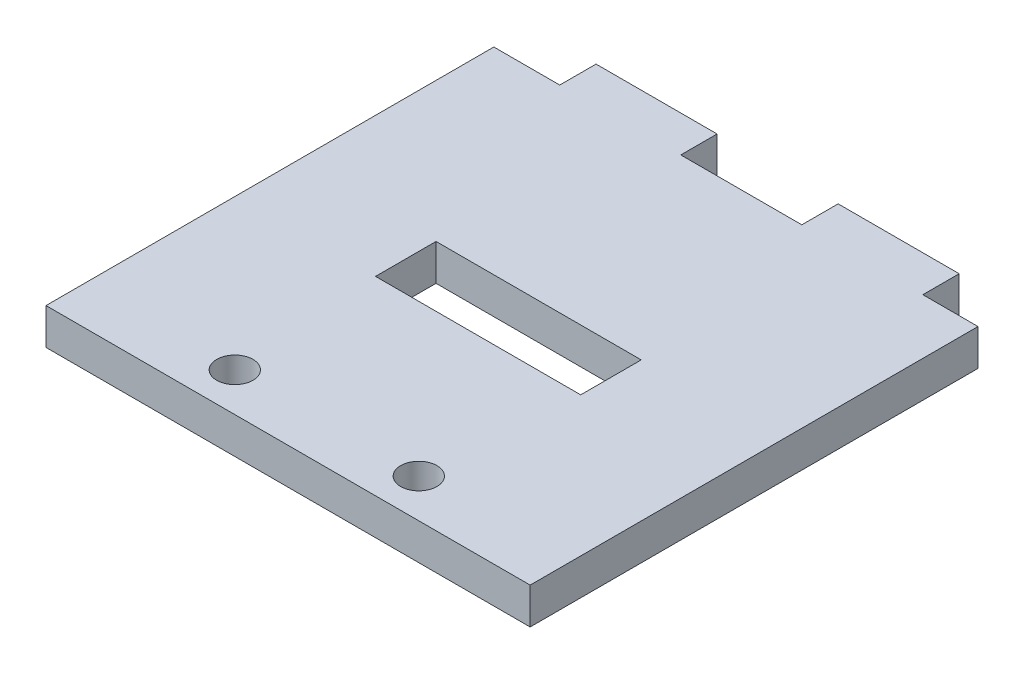
ISO-10303-21;
HEADER;
FILE_DESCRIPTION(('STEP AP214'),'2;1');
FILE_NAME('part.step','',(''),(''),'','','');
FILE_SCHEMA(('AUTOMOTIVE_DESIGN { 1 0 10303 214 1 1 1 1 }'));
ENDSEC;
DATA;
#1=APPLICATION_CONTEXT('core data for automotive mechanical design processes');
#2=APPLICATION_PROTOCOL_DEFINITION('international standard','automotive_design',2000,#1);
#3=PRODUCT_CONTEXT('',#1,'mechanical');
#4=PRODUCT('Part','Part','',(#3));
#5=PRODUCT_RELATED_PRODUCT_CATEGORY('part','',(#4));
#6=PRODUCT_DEFINITION_FORMATION('','',#4);
#7=PRODUCT_DEFINITION_CONTEXT('part definition',#1,'design');
#8=PRODUCT_DEFINITION('design','',#6,#7);
#9=PRODUCT_DEFINITION_SHAPE('','',#8);
#10=(LENGTH_UNIT() NAMED_UNIT(*) SI_UNIT(.MILLI.,.METRE.));
#11=(NAMED_UNIT(*) PLANE_ANGLE_UNIT() SI_UNIT($,.RADIAN.));
#12=(NAMED_UNIT(*) SI_UNIT($,.STERADIAN.) SOLID_ANGLE_UNIT());
#13=UNCERTAINTY_MEASURE_WITH_UNIT(LENGTH_MEASURE(1.E-05),#10,'distance_accuracy_value','');
#14=(GEOMETRIC_REPRESENTATION_CONTEXT(3) GLOBAL_UNCERTAINTY_ASSIGNED_CONTEXT((#13)) GLOBAL_UNIT_ASSIGNED_CONTEXT((#10,
#11,#12)) REPRESENTATION_CONTEXT('',''));
#15=CARTESIAN_POINT('',(0.,0.,0.));
#16=DIRECTION('',(0.,0.,1.));
#17=DIRECTION('',(1.,0.,0.));
#18=AXIS2_PLACEMENT_3D('',#15,#16,#17);
#19=CARTESIAN_POINT('',(-20.,3.,-20.));
#20=DIRECTION('',(0.,0.,1.));
#21=DIRECTION('',(1.,0.,0.));
#22=AXIS2_PLACEMENT_3D('',#19,#20,#21);
#23=PLANE('',#22);
#24=DIRECTION('',(-1.,0.,0.));
#25=VECTOR('',#24,1.);
#26=CARTESIAN_POINT('',(-20.,0.,-20.));
#27=LINE('',#26,#25);
#28=CARTESIAN_POINT('',(-4.55550933330212,0.,-20.));
#29=VERTEX_POINT('',#28);
#30=CARTESIAN_POINT('',(-14.5555093333021,0.,-20.));
#31=VERTEX_POINT('',#30);
#32=EDGE_CURVE('E267',#29,#31,#27,.T.);
#33=ORIENTED_EDGE('',*,*,#32,.T.);
#34=DIRECTION('',(0.,-1.,0.));
#35=VECTOR('',#34,1.);
#36=CARTESIAN_POINT('',(-14.5555093333021,10.,-20.));
#37=LINE('',#36,#35);
#38=CARTESIAN_POINT('',(-14.5555093333021,3.,-20.));
#39=VERTEX_POINT('',#38);
#40=EDGE_CURVE('E56',#39,#31,#37,.T.);
#41=ORIENTED_EDGE('',*,*,#40,.F.);
#42=DIRECTION('',(-1.,0.,0.));
#43=VECTOR('',#42,1.);
#44=CARTESIAN_POINT('',(-20.,3.,-20.));
#45=LINE('',#44,#43);
#46=CARTESIAN_POINT('',(-4.55550933330212,3.,-20.));
#47=VERTEX_POINT('',#46);
#48=EDGE_CURVE('E225',#47,#39,#45,.T.);
#49=ORIENTED_EDGE('',*,*,#48,.F.);
#50=DIRECTION('',(0.,-1.,0.));
#51=VECTOR('',#50,1.);
#52=CARTESIAN_POINT('',(-4.55550933330212,10.,-20.));
#53=LINE('',#52,#51);
#54=EDGE_CURVE('E201',#47,#29,#53,.T.);
#55=ORIENTED_EDGE('',*,*,#54,.T.);
#56=EDGE_LOOP('',(#33,#41,#49,#55));
#57=FACE_BOUND('',#56,.T.);
#58=ADVANCED_FACE('F41',(#57),#23,.F.);
#59=CARTESIAN_POINT('',(20.,3.,-20.));
#60=DIRECTION('',(-1.,0.,0.));
#61=DIRECTION('',(0.,0.,1.));
#62=AXIS2_PLACEMENT_3D('',#59,#60,#61);
#63=PLANE('',#62);
#64=DIRECTION('',(0.,0.,-1.));
#65=VECTOR('',#64,1.);
#66=CARTESIAN_POINT('',(20.,0.,-20.));
#67=LINE('',#66,#65);
#68=CARTESIAN_POINT('',(20.,0.,20.));
#69=VERTEX_POINT('',#68);
#70=CARTESIAN_POINT('',(20.,0.,-16.9999999999999));
#71=VERTEX_POINT('',#70);
#72=EDGE_CURVE('E265',#69,#71,#67,.T.);
#73=ORIENTED_EDGE('',*,*,#72,.T.);
#74=DIRECTION('',(0.,-1.,0.));
#75=VECTOR('',#74,1.);
#76=CARTESIAN_POINT('',(20.,10.,-16.9999999999999));
#77=LINE('',#76,#75);
#78=CARTESIAN_POINT('',(20.,3.,-16.9999999999999));
#79=VERTEX_POINT('',#78);
#80=EDGE_CURVE('E166',#79,#71,#77,.T.);
#81=ORIENTED_EDGE('',*,*,#80,.F.);
#82=DIRECTION('',(0.,0.,-1.));
#83=VECTOR('',#82,1.);
#84=CARTESIAN_POINT('',(20.,3.,-20.));
#85=LINE('',#84,#83);
#86=CARTESIAN_POINT('',(20.,3.,20.));
#87=VERTEX_POINT('',#86);
#88=EDGE_CURVE('E231',#87,#79,#85,.T.);
#89=ORIENTED_EDGE('',*,*,#88,.F.);
#90=DIRECTION('',(0.,-1.,0.));
#91=VECTOR('',#90,1.);
#92=CARTESIAN_POINT('',(20.,3.,20.));
#93=LINE('',#92,#91);
#94=EDGE_CURVE('E49',#87,#69,#93,.T.);
#95=ORIENTED_EDGE('',*,*,#94,.T.);
#96=EDGE_LOOP('',(#73,#81,#89,#95));
#97=FACE_BOUND('',#96,.T.);
#98=ADVANCED_FACE('F43',(#97),#63,.F.);
#99=CARTESIAN_POINT('',(15.4444906666979,0.,-20.));
#100=VERTEX_POINT('',#99);
#101=CARTESIAN_POINT('',(5.44449066669788,0.,-20.));
#102=VERTEX_POINT('',#101);
#103=EDGE_CURVE('E180',#100,#102,#27,.T.);
#104=ORIENTED_EDGE('',*,*,#103,.T.);
#105=DIRECTION('',(0.,-1.,0.));
#106=VECTOR('',#105,1.);
#107=CARTESIAN_POINT('',(5.44449066669788,10.,-20.));
#108=LINE('',#107,#106);
#109=CARTESIAN_POINT('',(5.44449066669788,3.,-20.));
#110=VERTEX_POINT('',#109);
#111=EDGE_CURVE('E64',#110,#102,#108,.T.);
#112=ORIENTED_EDGE('',*,*,#111,.F.);
#113=CARTESIAN_POINT('',(15.4444906666979,3.,-20.));
#114=VERTEX_POINT('',#113);
#115=EDGE_CURVE('E230',#114,#110,#45,.T.);
#116=ORIENTED_EDGE('',*,*,#115,.F.);
#117=DIRECTION('',(0.,-1.,0.));
#118=VECTOR('',#117,1.);
#119=CARTESIAN_POINT('',(15.4444906666979,10.,-20.));
#120=LINE('',#119,#118);
#121=EDGE_CURVE('E165',#114,#100,#120,.T.);
#122=ORIENTED_EDGE('',*,*,#121,.T.);
#123=EDGE_LOOP('',(#104,#112,#116,#122));
#124=FACE_BOUND('',#123,.T.);
#125=ADVANCED_FACE('F314',(#124),#23,.F.);
#126=CARTESIAN_POINT('',(-20.,3.,-20.));
#127=DIRECTION('',(1.,0.,0.));
#128=DIRECTION('',(0.,0.,-1.));
#129=AXIS2_PLACEMENT_3D('',#126,#127,#128);
#130=PLANE('',#129);
#131=DIRECTION('',(0.,0.,1.));
#132=VECTOR('',#131,1.);
#133=CARTESIAN_POINT('',(-20.,3.,-20.));
#134=LINE('',#133,#132);
#135=CARTESIAN_POINT('',(-20.,3.,-16.9999999999999));
#136=VERTEX_POINT('',#135);
#137=CARTESIAN_POINT('',(-20.,3.,20.));
#138=VERTEX_POINT('',#137);
#139=EDGE_CURVE('E234',#136,#138,#134,.T.);
#140=ORIENTED_EDGE('',*,*,#139,.F.);
#141=DIRECTION('',(0.,-1.,0.));
#142=VECTOR('',#141,1.);
#143=CARTESIAN_POINT('',(-20.,10.,-16.9999999999999));
#144=LINE('',#143,#142);
#145=CARTESIAN_POINT('',(-20.,0.,-16.9999999999999));
#146=VERTEX_POINT('',#145);
#147=EDGE_CURVE('E194',#136,#146,#144,.T.);
#148=ORIENTED_EDGE('',*,*,#147,.T.);
#149=DIRECTION('',(0.,0.,1.));
#150=VECTOR('',#149,1.);
#151=CARTESIAN_POINT('',(-20.,0.,-20.));
#152=LINE('',#151,#150);
#153=CARTESIAN_POINT('',(-20.,0.,20.));
#154=VERTEX_POINT('',#153);
#155=EDGE_CURVE('E271',#146,#154,#152,.T.);
#156=ORIENTED_EDGE('',*,*,#155,.T.);
#157=DIRECTION('',(0.,-1.,0.));
#158=VECTOR('',#157,1.);
#159=CARTESIAN_POINT('',(-20.,3.,20.));
#160=LINE('',#159,#158);
#161=EDGE_CURVE('E12',#138,#154,#160,.T.);
#162=ORIENTED_EDGE('',*,*,#161,.F.);
#163=EDGE_LOOP('',(#140,#148,#156,#162));
#164=FACE_BOUND('',#163,.T.);
#165=ADVANCED_FACE('F287',(#164),#130,.F.);
#166=CARTESIAN_POINT('',(-20.,3.,20.));
#167=DIRECTION('',(0.,0.,-1.));
#168=DIRECTION('',(-1.,0.,0.));
#169=AXIS2_PLACEMENT_3D('',#166,#167,#168);
#170=PLANE('',#169);
#171=DIRECTION('',(1.,0.,0.));
#172=VECTOR('',#171,1.);
#173=CARTESIAN_POINT('',(-20.,0.,20.));
#174=LINE('',#173,#172);
#175=EDGE_CURVE('E273',#154,#69,#174,.T.);
#176=ORIENTED_EDGE('',*,*,#175,.T.);
#177=ORIENTED_EDGE('',*,*,#94,.F.);
#178=DIRECTION('',(1.,0.,0.));
#179=VECTOR('',#178,1.);
#180=CARTESIAN_POINT('',(-20.,3.,20.));
#181=LINE('',#180,#179);
#182=EDGE_CURVE('E261',#138,#87,#181,.T.);
#183=ORIENTED_EDGE('',*,*,#182,.F.);
#184=ORIENTED_EDGE('',*,*,#161,.T.);
#185=EDGE_LOOP('',(#176,#177,#183,#184));
#186=FACE_BOUND('',#185,.T.);
#187=ADVANCED_FACE('F283',(#186),#170,.F.);
#188=CARTESIAN_POINT('',(0.,3.,0.));
#189=DIRECTION('',(0.,1.,0.));
#190=DIRECTION('',(0.,0.,1.));
#191=AXIS2_PLACEMENT_3D('',#188,#189,#190);
#192=PLANE('',#191);
#193=DIRECTION('',(1.,0.,0.));
#194=VECTOR('',#193,1.);
#195=CARTESIAN_POINT('',(0.,3.,-16.9999999999999));
#196=LINE('',#195,#194);
#197=CARTESIAN_POINT('',(-14.5555093333021,3.,-16.9999999999999));
#198=VERTEX_POINT('',#197);
#199=EDGE_CURVE('E249',#136,#198,#196,.T.);
#200=ORIENTED_EDGE('',*,*,#199,.F.);
#201=ORIENTED_EDGE('',*,*,#139,.T.);
#202=ORIENTED_EDGE('',*,*,#182,.T.);
#203=ORIENTED_EDGE('',*,*,#88,.T.);
#204=DIRECTION('',(1.,0.,0.));
#205=VECTOR('',#204,1.);
#206=CARTESIAN_POINT('',(0.,3.,-16.9999999999999));
#207=LINE('',#206,#205);
#208=CARTESIAN_POINT('',(15.4444906666979,3.,-16.9999999999999));
#209=VERTEX_POINT('',#208);
#210=EDGE_CURVE('E197',#209,#79,#207,.T.);
#211=ORIENTED_EDGE('',*,*,#210,.F.);
#212=DIRECTION('',(0.,0.,1.));
#213=VECTOR('',#212,1.);
#214=CARTESIAN_POINT('',(15.4444906666979,3.,0.));
#215=LINE('',#214,#213);
#216=EDGE_CURVE('E162',#114,#209,#215,.T.);
#217=ORIENTED_EDGE('',*,*,#216,.F.);
#218=ORIENTED_EDGE('',*,*,#115,.T.);
#219=DIRECTION('',(0.,0.,-1.));
#220=VECTOR('',#219,1.);
#221=CARTESIAN_POINT('',(5.44449066669789,3.,0.));
#222=LINE('',#221,#220);
#223=CARTESIAN_POINT('',(5.44449066669788,3.,-16.9999999999999));
#224=VERTEX_POINT('',#223);
#225=EDGE_CURVE('E318',#224,#110,#222,.T.);
#226=ORIENTED_EDGE('',*,*,#225,.F.);
#227=DIRECTION('',(1.,0.,0.));
#228=VECTOR('',#227,1.);
#229=CARTESIAN_POINT('',(0.,3.,-16.9999999999999));
#230=LINE('',#229,#228);
#231=CARTESIAN_POINT('',(-4.55550933330212,3.,-16.9999999999999));
#232=VERTEX_POINT('',#231);
#233=EDGE_CURVE('E310',#232,#224,#230,.T.);
#234=ORIENTED_EDGE('',*,*,#233,.F.);
#235=DIRECTION('',(0.,0.,1.));
#236=VECTOR('',#235,1.);
#237=CARTESIAN_POINT('',(-4.55550933330211,3.,0.));
#238=LINE('',#237,#236);
#239=EDGE_CURVE('E250',#47,#232,#238,.T.);
#240=ORIENTED_EDGE('',*,*,#239,.F.);
#241=ORIENTED_EDGE('',*,*,#48,.T.);
#242=DIRECTION('',(0.,0.,-1.));
#243=VECTOR('',#242,1.);
#244=CARTESIAN_POINT('',(-14.5555093333021,3.,0.));
#245=LINE('',#244,#243);
#246=EDGE_CURVE('E245',#198,#39,#245,.T.);
#247=ORIENTED_EDGE('',*,*,#246,.F.);
#248=EDGE_LOOP('',(#200,#201,#202,#203,#211,#217,#218,#226,#234,#240,#241,#247));
#249=FACE_BOUND('',#248,.T.);
#250=DIRECTION('',(0.,0.,1.));
#251=VECTOR('',#250,1.);
#252=CARTESIAN_POINT('',(-8.47548157719302,3.,0.));
#253=LINE('',#252,#251);
#254=CARTESIAN_POINT('',(-8.47548157719302,3.,-0.700000000000007));
#255=VERTEX_POINT('',#254);
#256=CARTESIAN_POINT('',(-8.47548157719302,3.,4.29999999999999));
#257=VERTEX_POINT('',#256);
#258=EDGE_CURVE('E268',#255,#257,#253,.T.);
#259=ORIENTED_EDGE('',*,*,#258,.F.);
#260=DIRECTION('',(-1.,0.,0.));
#261=VECTOR('',#260,1.);
#262=CARTESIAN_POINT('',(0.,3.,-0.700000000000006));
#263=LINE('',#262,#261);
#264=CARTESIAN_POINT('',(8.47548157719302,3.,-0.700000000000005));
#265=VERTEX_POINT('',#264);
#266=EDGE_CURVE('E328',#265,#255,#263,.T.);
#267=ORIENTED_EDGE('',*,*,#266,.F.);
#268=DIRECTION('',(0.,0.,-1.));
#269=VECTOR('',#268,1.);
#270=CARTESIAN_POINT('',(8.47548157719302,3.,0.));
#271=LINE('',#270,#269);
#272=CARTESIAN_POINT('',(8.47548157719302,3.,4.29999999999999));
#273=VERTEX_POINT('',#272);
#274=EDGE_CURVE('E330',#273,#265,#271,.T.);
#275=ORIENTED_EDGE('',*,*,#274,.F.);
#276=DIRECTION('',(1.,0.,0.));
#277=VECTOR('',#276,1.);
#278=CARTESIAN_POINT('',(0.,3.,4.29999999999999));
#279=LINE('',#278,#277);
#280=EDGE_CURVE('E327',#257,#273,#279,.T.);
#281=ORIENTED_EDGE('',*,*,#280,.F.);
#282=EDGE_LOOP('',(#259,#267,#275,#281));
#283=FACE_BOUND('',#282,.T.);
#284=CARTESIAN_POINT('',(-7.6,3.,16.8));
#285=DIRECTION('',(0.,1.,0.));
#286=DIRECTION('',(0.,0.,1.));
#287=AXIS2_PLACEMENT_3D('',#284,#285,#286);
#288=CIRCLE('',#287,1.5);
#289=CARTESIAN_POINT('',(-7.6,3.,18.3));
#290=VERTEX_POINT('',#289);
#291=EDGE_CURVE('E331',#290,#290,#288,.T.);
#292=ORIENTED_EDGE('',*,*,#291,.F.);
#293=EDGE_LOOP('',(#292));
#294=FACE_BOUND('',#293,.T.);
#295=CARTESIAN_POINT('',(7.6,3.,16.8));
#296=DIRECTION('',(0.,1.,0.));
#297=DIRECTION('',(0.,0.,1.));
#298=AXIS2_PLACEMENT_3D('',#295,#296,#297);
#299=CIRCLE('',#298,1.5);
#300=CARTESIAN_POINT('',(7.6,3.,18.3));
#301=VERTEX_POINT('',#300);
#302=EDGE_CURVE('E340',#301,#301,#299,.T.);
#303=ORIENTED_EDGE('',*,*,#302,.F.);
#304=EDGE_LOOP('',(#303));
#305=FACE_BOUND('',#304,.T.);
#306=ADVANCED_FACE('F294',(#249,#283,#294,#305),#192,.T.);
#307=CARTESIAN_POINT('',(0.,0.,0.));
#308=DIRECTION('',(0.,1.,0.));
#309=DIRECTION('',(0.,0.,1.));
#310=AXIS2_PLACEMENT_3D('',#307,#308,#309);
#311=PLANE('',#310);
#312=DIRECTION('',(1.,0.,0.));
#313=VECTOR('',#312,1.);
#314=CARTESIAN_POINT('',(8.47548157719302,0.,-0.700000000000005));
#315=LINE('',#314,#313);
#316=CARTESIAN_POINT('',(-8.47548157719302,0.,-0.700000000000007));
#317=VERTEX_POINT('',#316);
#318=CARTESIAN_POINT('',(8.47548157719302,0.,-0.700000000000005));
#319=VERTEX_POINT('',#318);
#320=EDGE_CURVE('E372',#317,#319,#315,.T.);
#321=ORIENTED_EDGE('',*,*,#320,.F.);
#322=DIRECTION('',(0.,0.,-1.));
#323=VECTOR('',#322,1.);
#324=CARTESIAN_POINT('',(-8.47548157719302,0.,-0.700000000000007));
#325=LINE('',#324,#323);
#326=CARTESIAN_POINT('',(-8.47548157719302,0.,4.29999999999999));
#327=VERTEX_POINT('',#326);
#328=EDGE_CURVE('E256',#327,#317,#325,.T.);
#329=ORIENTED_EDGE('',*,*,#328,.F.);
#330=DIRECTION('',(-1.,0.,0.));
#331=VECTOR('',#330,1.);
#332=CARTESIAN_POINT('',(8.47548157719302,0.,4.29999999999999));
#333=LINE('',#332,#331);
#334=CARTESIAN_POINT('',(8.47548157719302,0.,4.29999999999999));
#335=VERTEX_POINT('',#334);
#336=EDGE_CURVE('E361',#335,#327,#333,.T.);
#337=ORIENTED_EDGE('',*,*,#336,.F.);
#338=DIRECTION('',(0.,0.,1.));
#339=VECTOR('',#338,1.);
#340=CARTESIAN_POINT('',(8.47548157719302,0.,-0.700000000000005));
#341=LINE('',#340,#339);
#342=EDGE_CURVE('E369',#319,#335,#341,.T.);
#343=ORIENTED_EDGE('',*,*,#342,.F.);
#344=EDGE_LOOP('',(#321,#329,#337,#343));
#345=FACE_BOUND('',#344,.T.);
#346=CARTESIAN_POINT('',(-7.6,0.,16.8));
#347=DIRECTION('',(0.,-1.,0.));
#348=DIRECTION('',(0.,0.,-1.));
#349=AXIS2_PLACEMENT_3D('',#346,#347,#348);
#350=CIRCLE('',#349,1.5);
#351=CARTESIAN_POINT('',(-7.6,0.,15.3));
#352=VERTEX_POINT('',#351);
#353=EDGE_CURVE('E257',#352,#352,#350,.T.);
#354=ORIENTED_EDGE('',*,*,#353,.F.);
#355=EDGE_LOOP('',(#354));
#356=FACE_BOUND('',#355,.T.);
#357=CARTESIAN_POINT('',(7.6,0.,16.8));
#358=DIRECTION('',(0.,-1.,0.));
#359=DIRECTION('',(0.,0.,-1.));
#360=AXIS2_PLACEMENT_3D('',#357,#358,#359);
#361=CIRCLE('',#360,1.5);
#362=CARTESIAN_POINT('',(7.6,0.,15.3));
#363=VERTEX_POINT('',#362);
#364=EDGE_CURVE('E343',#363,#363,#361,.T.);
#365=ORIENTED_EDGE('',*,*,#364,.F.);
#366=EDGE_LOOP('',(#365));
#367=FACE_BOUND('',#366,.T.);
#368=ORIENTED_EDGE('',*,*,#155,.F.);
#369=DIRECTION('',(-1.,0.,0.));
#370=VECTOR('',#369,1.);
#371=CARTESIAN_POINT('',(-14.5555093333021,0.,-16.9999999999999));
#372=LINE('',#371,#370);
#373=CARTESIAN_POINT('',(-14.5555093333021,0.,-16.9999999999999));
#374=VERTEX_POINT('',#373);
#375=EDGE_CURVE('E192',#374,#146,#372,.T.);
#376=ORIENTED_EDGE('',*,*,#375,.F.);
#377=DIRECTION('',(0.,0.,1.));
#378=VECTOR('',#377,1.);
#379=CARTESIAN_POINT('',(-14.5555093333021,0.,-20.));
#380=LINE('',#379,#378);
#381=EDGE_CURVE('E190',#31,#374,#380,.T.);
#382=ORIENTED_EDGE('',*,*,#381,.F.);
#383=ORIENTED_EDGE('',*,*,#32,.F.);
#384=DIRECTION('',(0.,0.,-1.));
#385=VECTOR('',#384,1.);
#386=CARTESIAN_POINT('',(-4.55550933330212,0.,-16.9999999999999));
#387=LINE('',#386,#385);
#388=CARTESIAN_POINT('',(-4.55550933330212,0.,-16.9999999999999));
#389=VERTEX_POINT('',#388);
#390=EDGE_CURVE('E188',#389,#29,#387,.T.);
#391=ORIENTED_EDGE('',*,*,#390,.F.);
#392=DIRECTION('',(-1.,0.,0.));
#393=VECTOR('',#392,1.);
#394=CARTESIAN_POINT('',(5.44449066669788,0.,-16.9999999999999));
#395=LINE('',#394,#393);
#396=CARTESIAN_POINT('',(5.44449066669788,0.,-16.9999999999999));
#397=VERTEX_POINT('',#396);
#398=EDGE_CURVE('E183',#397,#389,#395,.T.);
#399=ORIENTED_EDGE('',*,*,#398,.F.);
#400=DIRECTION('',(0.,0.,1.));
#401=VECTOR('',#400,1.);
#402=CARTESIAN_POINT('',(5.44449066669788,0.,-20.));
#403=LINE('',#402,#401);
#404=EDGE_CURVE('E181',#102,#397,#403,.T.);
#405=ORIENTED_EDGE('',*,*,#404,.F.);
#406=ORIENTED_EDGE('',*,*,#103,.F.);
#407=DIRECTION('',(0.,0.,-1.));
#408=VECTOR('',#407,1.);
#409=CARTESIAN_POINT('',(15.4444906666979,0.,-16.9999999999999));
#410=LINE('',#409,#408);
#411=CARTESIAN_POINT('',(15.4444906666979,0.,-16.9999999999999));
#412=VERTEX_POINT('',#411);
#413=EDGE_CURVE('E159',#412,#100,#410,.T.);
#414=ORIENTED_EDGE('',*,*,#413,.F.);
#415=DIRECTION('',(-1.,0.,0.));
#416=VECTOR('',#415,1.);
#417=CARTESIAN_POINT('',(20.,0.,-16.9999999999999));
#418=LINE('',#417,#416);
#419=EDGE_CURVE('E169',#71,#412,#418,.T.);
#420=ORIENTED_EDGE('',*,*,#419,.F.);
#421=ORIENTED_EDGE('',*,*,#72,.F.);
#422=ORIENTED_EDGE('',*,*,#175,.F.);
#423=EDGE_LOOP('',(#368,#376,#382,#383,#391,#399,#405,#406,#414,#420,#421,#422));
#424=FACE_BOUND('',#423,.T.);
#425=ADVANCED_FACE('F178',(#345,#356,#367,#424),#311,.F.);
#426=CARTESIAN_POINT('',(7.6,10.,16.8));
#427=DIRECTION('',(0.,-1.,0.));
#428=DIRECTION('',(0.,0.,-1.));
#429=AXIS2_PLACEMENT_3D('',#426,#427,#428);
#430=CYLINDRICAL_SURFACE('',#429,1.5);
#431=ORIENTED_EDGE('',*,*,#302,.T.);
#432=EDGE_LOOP('',(#431));
#433=FACE_BOUND('',#432,.T.);
#434=ORIENTED_EDGE('',*,*,#364,.T.);
#435=EDGE_LOOP('',(#434));
#436=FACE_BOUND('',#435,.T.);
#437=ADVANCED_FACE('F424',(#433,#436),#430,.F.);
#438=CARTESIAN_POINT('',(-7.6,10.,16.8));
#439=DIRECTION('',(0.,-1.,0.));
#440=DIRECTION('',(0.,0.,-1.));
#441=AXIS2_PLACEMENT_3D('',#438,#439,#440);
#442=CYLINDRICAL_SURFACE('',#441,1.5);
#443=ORIENTED_EDGE('',*,*,#291,.T.);
#444=EDGE_LOOP('',(#443));
#445=FACE_BOUND('',#444,.T.);
#446=ORIENTED_EDGE('',*,*,#353,.T.);
#447=EDGE_LOOP('',(#446));
#448=FACE_BOUND('',#447,.T.);
#449=ADVANCED_FACE('F403',(#445,#448),#442,.F.);
#450=CARTESIAN_POINT('',(-8.47548157719302,10.,-0.700000000000007));
#451=DIRECTION('',(-1.,0.,0.));
#452=DIRECTION('',(0.,0.,1.));
#453=AXIS2_PLACEMENT_3D('',#450,#451,#452);
#454=PLANE('',#453);
#455=ORIENTED_EDGE('',*,*,#258,.T.);
#456=DIRECTION('',(0.,-1.,0.));
#457=VECTOR('',#456,1.);
#458=CARTESIAN_POINT('',(-8.47548157719302,10.,4.29999999999999));
#459=LINE('',#458,#457);
#460=EDGE_CURVE('E365',#257,#327,#459,.T.);
#461=ORIENTED_EDGE('',*,*,#460,.T.);
#462=ORIENTED_EDGE('',*,*,#328,.T.);
#463=DIRECTION('',(0.,-1.,0.));
#464=VECTOR('',#463,1.);
#465=CARTESIAN_POINT('',(-8.47548157719302,10.,-0.700000000000007));
#466=LINE('',#465,#464);
#467=EDGE_CURVE('E357',#255,#317,#466,.T.);
#468=ORIENTED_EDGE('',*,*,#467,.F.);
#469=EDGE_LOOP('',(#455,#461,#462,#468));
#470=FACE_BOUND('',#469,.T.);
#471=ADVANCED_FACE('F377',(#470),#454,.F.);
#472=CARTESIAN_POINT('',(8.47548157719302,10.,4.29999999999999));
#473=DIRECTION('',(0.,0.,1.));
#474=DIRECTION('',(1.,0.,0.));
#475=AXIS2_PLACEMENT_3D('',#472,#473,#474);
#476=PLANE('',#475);
#477=ORIENTED_EDGE('',*,*,#280,.T.);
#478=DIRECTION('',(0.,-1.,0.));
#479=VECTOR('',#478,1.);
#480=CARTESIAN_POINT('',(8.47548157719302,10.,4.29999999999999));
#481=LINE('',#480,#479);
#482=EDGE_CURVE('E363',#273,#335,#481,.T.);
#483=ORIENTED_EDGE('',*,*,#482,.T.);
#484=ORIENTED_EDGE('',*,*,#336,.T.);
#485=ORIENTED_EDGE('',*,*,#460,.F.);
#486=EDGE_LOOP('',(#477,#483,#484,#485));
#487=FACE_BOUND('',#486,.T.);
#488=ADVANCED_FACE('F395',(#487),#476,.F.);
#489=CARTESIAN_POINT('',(8.47548157719302,10.,-0.700000000000005));
#490=DIRECTION('',(1.,0.,0.));
#491=DIRECTION('',(0.,0.,-1.));
#492=AXIS2_PLACEMENT_3D('',#489,#490,#491);
#493=PLANE('',#492);
#494=ORIENTED_EDGE('',*,*,#274,.T.);
#495=DIRECTION('',(0.,-1.,0.));
#496=VECTOR('',#495,1.);
#497=CARTESIAN_POINT('',(8.47548157719302,10.,-0.700000000000005));
#498=LINE('',#497,#496);
#499=EDGE_CURVE('E360',#265,#319,#498,.T.);
#500=ORIENTED_EDGE('',*,*,#499,.T.);
#501=ORIENTED_EDGE('',*,*,#342,.T.);
#502=ORIENTED_EDGE('',*,*,#482,.F.);
#503=EDGE_LOOP('',(#494,#500,#501,#502));
#504=FACE_BOUND('',#503,.T.);
#505=ADVANCED_FACE('F390',(#504),#493,.F.);
#506=CARTESIAN_POINT('',(8.47548157719302,10.,-0.700000000000005));
#507=DIRECTION('',(0.,0.,-1.));
#508=DIRECTION('',(-1.,0.,0.));
#509=AXIS2_PLACEMENT_3D('',#506,#507,#508);
#510=PLANE('',#509);
#511=ORIENTED_EDGE('',*,*,#266,.T.);
#512=ORIENTED_EDGE('',*,*,#467,.T.);
#513=ORIENTED_EDGE('',*,*,#320,.T.);
#514=ORIENTED_EDGE('',*,*,#499,.F.);
#515=EDGE_LOOP('',(#511,#512,#513,#514));
#516=FACE_BOUND('',#515,.T.);
#517=ADVANCED_FACE('F384',(#516),#510,.F.);
#518=CARTESIAN_POINT('',(20.,10.,-16.9999999999999));
#519=DIRECTION('',(0.,0.,1.));
#520=DIRECTION('',(1.,0.,0.));
#521=AXIS2_PLACEMENT_3D('',#518,#519,#520);
#522=PLANE('',#521);
#523=ORIENTED_EDGE('',*,*,#210,.T.);
#524=ORIENTED_EDGE('',*,*,#80,.T.);
#525=ORIENTED_EDGE('',*,*,#419,.T.);
#526=DIRECTION('',(0.,-1.,0.));
#527=VECTOR('',#526,1.);
#528=CARTESIAN_POINT('',(15.4444906666979,10.,-16.9999999999999));
#529=LINE('',#528,#527);
#530=EDGE_CURVE('E155',#209,#412,#529,.T.);
#531=ORIENTED_EDGE('',*,*,#530,.F.);
#532=EDGE_LOOP('',(#523,#524,#525,#531));
#533=FACE_BOUND('',#532,.T.);
#534=ADVANCED_FACE('F170',(#533),#522,.F.);
#535=CARTESIAN_POINT('',(15.4444906666979,10.,-16.9999999999999));
#536=DIRECTION('',(-1.,0.,0.));
#537=DIRECTION('',(0.,0.,1.));
#538=AXIS2_PLACEMENT_3D('',#535,#536,#537);
#539=PLANE('',#538);
#540=ORIENTED_EDGE('',*,*,#216,.T.);
#541=ORIENTED_EDGE('',*,*,#530,.T.);
#542=ORIENTED_EDGE('',*,*,#413,.T.);
#543=ORIENTED_EDGE('',*,*,#121,.F.);
#544=EDGE_LOOP('',(#540,#541,#542,#543));
#545=FACE_BOUND('',#544,.T.);
#546=ADVANCED_FACE('F157',(#545),#539,.F.);
#547=CARTESIAN_POINT('',(5.44449066669788,10.,-20.));
#548=DIRECTION('',(1.,0.,0.));
#549=DIRECTION('',(0.,0.,-1.));
#550=AXIS2_PLACEMENT_3D('',#547,#548,#549);
#551=PLANE('',#550);
#552=ORIENTED_EDGE('',*,*,#225,.T.);
#553=ORIENTED_EDGE('',*,*,#111,.T.);
#554=ORIENTED_EDGE('',*,*,#404,.T.);
#555=DIRECTION('',(0.,-1.,0.));
#556=VECTOR('',#555,1.);
#557=CARTESIAN_POINT('',(5.44449066669788,10.,-16.9999999999999));
#558=LINE('',#557,#556);
#559=EDGE_CURVE('E206',#224,#397,#558,.T.);
#560=ORIENTED_EDGE('',*,*,#559,.F.);
#561=EDGE_LOOP('',(#552,#553,#554,#560));
#562=FACE_BOUND('',#561,.T.);
#563=ADVANCED_FACE('F312',(#562),#551,.F.);
#564=CARTESIAN_POINT('',(5.44449066669788,10.,-16.9999999999999));
#565=DIRECTION('',(0.,0.,1.));
#566=DIRECTION('',(1.,0.,0.));
#567=AXIS2_PLACEMENT_3D('',#564,#565,#566);
#568=PLANE('',#567);
#569=ORIENTED_EDGE('',*,*,#233,.T.);
#570=ORIENTED_EDGE('',*,*,#559,.T.);
#571=ORIENTED_EDGE('',*,*,#398,.T.);
#572=DIRECTION('',(0.,-1.,0.));
#573=VECTOR('',#572,1.);
#574=CARTESIAN_POINT('',(-4.55550933330212,10.,-16.9999999999999));
#575=LINE('',#574,#573);
#576=EDGE_CURVE('E204',#232,#389,#575,.T.);
#577=ORIENTED_EDGE('',*,*,#576,.F.);
#578=EDGE_LOOP('',(#569,#570,#571,#577));
#579=FACE_BOUND('',#578,.T.);
#580=ADVANCED_FACE('F308',(#579),#568,.F.);
#581=CARTESIAN_POINT('',(-4.55550933330212,10.,-16.9999999999999));
#582=DIRECTION('',(-1.,0.,0.));
#583=DIRECTION('',(0.,0.,1.));
#584=AXIS2_PLACEMENT_3D('',#581,#582,#583);
#585=PLANE('',#584);
#586=ORIENTED_EDGE('',*,*,#239,.T.);
#587=ORIENTED_EDGE('',*,*,#576,.T.);
#588=ORIENTED_EDGE('',*,*,#390,.T.);
#589=ORIENTED_EDGE('',*,*,#54,.F.);
#590=EDGE_LOOP('',(#586,#587,#588,#589));
#591=FACE_BOUND('',#590,.T.);
#592=ADVANCED_FACE('F304',(#591),#585,.F.);
#593=CARTESIAN_POINT('',(-14.5555093333021,10.,-16.9999999999999));
#594=DIRECTION('',(0.,0.,1.));
#595=DIRECTION('',(1.,0.,0.));
#596=AXIS2_PLACEMENT_3D('',#593,#594,#595);
#597=PLANE('',#596);
#598=ORIENTED_EDGE('',*,*,#199,.T.);
#599=DIRECTION('',(0.,-1.,0.));
#600=VECTOR('',#599,1.);
#601=CARTESIAN_POINT('',(-14.5555093333021,10.,-16.9999999999999));
#602=LINE('',#601,#600);
#603=EDGE_CURVE('E198',#198,#374,#602,.T.);
#604=ORIENTED_EDGE('',*,*,#603,.T.);
#605=ORIENTED_EDGE('',*,*,#375,.T.);
#606=ORIENTED_EDGE('',*,*,#147,.F.);
#607=EDGE_LOOP('',(#598,#604,#605,#606));
#608=FACE_BOUND('',#607,.T.);
#609=ADVANCED_FACE('F290',(#608),#597,.F.);
#610=CARTESIAN_POINT('',(-14.5555093333021,10.,-20.));
#611=DIRECTION('',(1.,0.,0.));
#612=DIRECTION('',(0.,0.,-1.));
#613=AXIS2_PLACEMENT_3D('',#610,#611,#612);
#614=PLANE('',#613);
#615=ORIENTED_EDGE('',*,*,#246,.T.);
#616=ORIENTED_EDGE('',*,*,#40,.T.);
#617=ORIENTED_EDGE('',*,*,#381,.T.);
#618=ORIENTED_EDGE('',*,*,#603,.F.);
#619=EDGE_LOOP('',(#615,#616,#617,#618));
#620=FACE_BOUND('',#619,.T.);
#621=ADVANCED_FACE('F298',(#620),#614,.F.);
#622=CLOSED_SHELL('',(#58,#98,#125,#165,#187,#306,#425,#437,#449,#471,#488,#505,#517,#534,#546,
#563,#580,#592,#609,#621));
#623=MANIFOLD_SOLID_BREP('B2',#622);
#624=ADVANCED_BREP_SHAPE_REPRESENTATION('',(#18,#623),#14);
#625=SHAPE_DEFINITION_REPRESENTATION(#9,#624);
ENDSEC;
END-ISO-10303-21;
